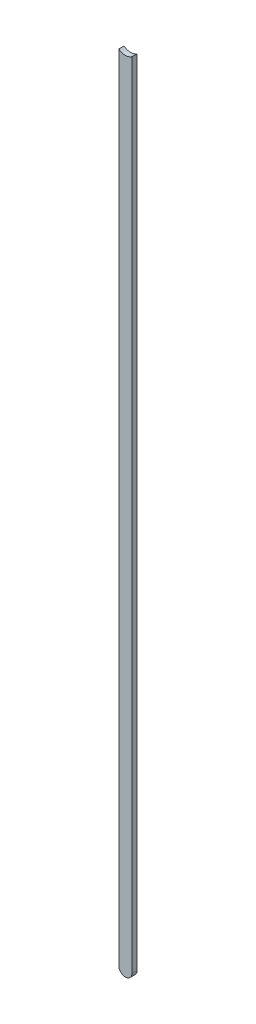
ISO-10303-21;
HEADER;
FILE_DESCRIPTION(('STEP AP214'),'2;1');
FILE_NAME('part.step','',(''),(''),'','','');
FILE_SCHEMA(('AUTOMOTIVE_DESIGN { 1 0 10303 214 1 1 1 1 }'));
ENDSEC;
DATA;
#1=APPLICATION_CONTEXT('core data for automotive mechanical design processes');
#2=APPLICATION_PROTOCOL_DEFINITION('international standard','automotive_design',2000,#1);
#3=PRODUCT_CONTEXT('',#1,'mechanical');
#4=PRODUCT('Part','Part','',(#3));
#5=PRODUCT_RELATED_PRODUCT_CATEGORY('part','',(#4));
#6=PRODUCT_DEFINITION_FORMATION('','',#4);
#7=PRODUCT_DEFINITION_CONTEXT('part definition',#1,'design');
#8=PRODUCT_DEFINITION('design','',#6,#7);
#9=PRODUCT_DEFINITION_SHAPE('','',#8);
#10=(LENGTH_UNIT() NAMED_UNIT(*) SI_UNIT(.MILLI.,.METRE.));
#11=(NAMED_UNIT(*) PLANE_ANGLE_UNIT() SI_UNIT($,.RADIAN.));
#12=(NAMED_UNIT(*) SI_UNIT($,.STERADIAN.) SOLID_ANGLE_UNIT());
#13=UNCERTAINTY_MEASURE_WITH_UNIT(LENGTH_MEASURE(1.E-05),#10,'distance_accuracy_value','');
#14=(GEOMETRIC_REPRESENTATION_CONTEXT(3) GLOBAL_UNCERTAINTY_ASSIGNED_CONTEXT((#13)) GLOBAL_UNIT_ASSIGNED_CONTEXT((#10,
#11,#12)) REPRESENTATION_CONTEXT('',''));
#15=CARTESIAN_POINT('',(0.,0.,0.));
#16=DIRECTION('',(0.,0.,1.));
#17=DIRECTION('',(1.,0.,0.));
#18=AXIS2_PLACEMENT_3D('',#15,#16,#17);
#19=CARTESIAN_POINT('',(104.521,78.613,0.));
#20=DIRECTION('',(-1.,0.,0.));
#21=DIRECTION('',(0.,1.,0.));
#22=AXIS2_PLACEMENT_3D('',#19,#20,#21);
#23=PLANE('',#22);
#24=DIRECTION('',(0.,1.,0.));
#25=VECTOR('',#24,1.);
#26=CARTESIAN_POINT('',(104.521,78.613,0.1999996));
#27=LINE('',#26,#25);
#28=CARTESIAN_POINT('',(104.521,78.613,0.1999996));
#29=VERTEX_POINT('',#28);
#30=CARTESIAN_POINT('',(104.521,109.006251768897,0.1999996));
#31=VERTEX_POINT('',#30);
#32=EDGE_CURVE('E11',#29,#31,#27,.T.);
#33=ORIENTED_EDGE('',*,*,#32,.F.);
#34=DIRECTION('',(0.,0.,1.));
#35=VECTOR('',#34,1.);
#36=CARTESIAN_POINT('',(104.521,78.613,0.));
#37=LINE('',#36,#35);
#38=CARTESIAN_POINT('',(104.521,78.613,0.));
#39=VERTEX_POINT('',#38);
#40=EDGE_CURVE('E24',#39,#29,#37,.T.);
#41=ORIENTED_EDGE('',*,*,#40,.F.);
#42=DIRECTION('',(0.,1.,0.));
#43=VECTOR('',#42,1.);
#44=CARTESIAN_POINT('',(104.521,78.613,0.));
#45=LINE('',#44,#43);
#46=CARTESIAN_POINT('',(104.521,109.006251768897,0.));
#47=VERTEX_POINT('',#46);
#48=EDGE_CURVE('E75',#39,#47,#45,.T.);
#49=ORIENTED_EDGE('',*,*,#48,.T.);
#50=DIRECTION('',(0.,0.,1.));
#51=VECTOR('',#50,1.);
#52=CARTESIAN_POINT('',(104.521,109.006251768897,0.));
#53=LINE('',#52,#51);
#54=EDGE_CURVE('E37',#47,#31,#53,.T.);
#55=ORIENTED_EDGE('',*,*,#54,.T.);
#56=EDGE_LOOP('',(#33,#41,#49,#55));
#57=FACE_BOUND('',#56,.T.);
#58=ADVANCED_FACE('F17',(#57),#23,.F.);
#59=CARTESIAN_POINT('',(104.267,109.347,0.));
#60=DIRECTION('',(0.,0.,-1.));
#61=DIRECTION('',(1.,0.,0.));
#62=AXIS2_PLACEMENT_3D('',#59,#60,#61);
#63=CYLINDRICAL_SURFACE('',#62,0.42500042);
#64=DIRECTION('',(0.,0.,1.));
#65=VECTOR('',#64,1.);
#66=CARTESIAN_POINT('',(104.013,109.006251768897,0.));
#67=LINE('',#66,#65);
#68=CARTESIAN_POINT('',(104.013,109.006251768897,0.));
#69=VERTEX_POINT('',#68);
#70=CARTESIAN_POINT('',(104.013,109.006251768897,0.1999996));
#71=VERTEX_POINT('',#70);
#72=EDGE_CURVE('E67',#69,#71,#67,.T.);
#73=ORIENTED_EDGE('',*,*,#72,.T.);
#74=CARTESIAN_POINT('',(104.267,109.347,0.1999996));
#75=DIRECTION('',(0.,0.,1.));
#76=DIRECTION('',(1.,0.,0.));
#77=AXIS2_PLACEMENT_3D('',#74,#75,#76);
#78=CIRCLE('',#77,0.42500042);
#79=EDGE_CURVE('E82',#71,#31,#78,.T.);
#80=ORIENTED_EDGE('',*,*,#79,.T.);
#81=ORIENTED_EDGE('',*,*,#54,.F.);
#82=CARTESIAN_POINT('',(104.267,109.347,0.));
#83=DIRECTION('',(0.,0.,1.));
#84=DIRECTION('',(1.,0.,0.));
#85=AXIS2_PLACEMENT_3D('',#82,#83,#84);
#86=CIRCLE('',#85,0.42500042);
#87=EDGE_CURVE('E80',#69,#47,#86,.T.);
#88=ORIENTED_EDGE('',*,*,#87,.F.);
#89=EDGE_LOOP('',(#73,#80,#81,#88));
#90=FACE_BOUND('',#89,.T.);
#91=ADVANCED_FACE('F88',(#90),#63,.F.);
#92=CARTESIAN_POINT('',(104.013,109.006251768897,0.));
#93=DIRECTION('',(1.,0.,0.));
#94=DIRECTION('',(0.,-1.,0.));
#95=AXIS2_PLACEMENT_3D('',#92,#93,#94);
#96=PLANE('',#95);
#97=DIRECTION('',(0.,-1.,0.));
#98=VECTOR('',#97,1.);
#99=CARTESIAN_POINT('',(104.013,109.347,0.1999996));
#100=LINE('',#99,#98);
#101=CARTESIAN_POINT('',(104.013,78.613,0.1999996));
#102=VERTEX_POINT('',#101);
#103=EDGE_CURVE('E71',#71,#102,#100,.T.);
#104=ORIENTED_EDGE('',*,*,#103,.F.);
#105=ORIENTED_EDGE('',*,*,#72,.F.);
#106=DIRECTION('',(0.,-1.,0.));
#107=VECTOR('',#106,1.);
#108=CARTESIAN_POINT('',(104.013,109.347,0.));
#109=LINE('',#108,#107);
#110=CARTESIAN_POINT('',(104.013,78.613,0.));
#111=VERTEX_POINT('',#110);
#112=EDGE_CURVE('E63',#69,#111,#109,.T.);
#113=ORIENTED_EDGE('',*,*,#112,.T.);
#114=DIRECTION('',(0.,0.,1.));
#115=VECTOR('',#114,1.);
#116=CARTESIAN_POINT('',(104.013,78.613,0.));
#117=LINE('',#116,#115);
#118=EDGE_CURVE('E53',#111,#102,#117,.T.);
#119=ORIENTED_EDGE('',*,*,#118,.T.);
#120=EDGE_LOOP('',(#104,#105,#113,#119));
#121=FACE_BOUND('',#120,.T.);
#122=ADVANCED_FACE('F66',(#121),#96,.F.);
#123=CARTESIAN_POINT('',(104.267,78.613,0.));
#124=DIRECTION('',(0.,0.,-1.));
#125=DIRECTION('',(-1.,0.,0.));
#126=AXIS2_PLACEMENT_3D('',#123,#124,#125);
#127=CYLINDRICAL_SURFACE('',#126,0.253999999999995);
#128=CARTESIAN_POINT('',(104.267,78.613,0.1999996));
#129=DIRECTION('',(0.,0.,1.));
#130=DIRECTION('',(-1.,0.,0.));
#131=AXIS2_PLACEMENT_3D('',#128,#129,#130);
#132=CIRCLE('',#131,0.253999999999995);
#133=EDGE_CURVE('E59',#102,#29,#132,.T.);
#134=ORIENTED_EDGE('',*,*,#133,.F.);
#135=ORIENTED_EDGE('',*,*,#118,.F.);
#136=CARTESIAN_POINT('',(104.267,78.613,0.));
#137=DIRECTION('',(0.,0.,1.));
#138=DIRECTION('',(-1.,0.,0.));
#139=AXIS2_PLACEMENT_3D('',#136,#137,#138);
#140=CIRCLE('',#139,0.253999999999995);
#141=EDGE_CURVE('E57',#111,#39,#140,.T.);
#142=ORIENTED_EDGE('',*,*,#141,.T.);
#143=ORIENTED_EDGE('',*,*,#40,.T.);
#144=EDGE_LOOP('',(#134,#135,#142,#143));
#145=FACE_BOUND('',#144,.T.);
#146=ADVANCED_FACE('F55',(#145),#127,.T.);
#147=CARTESIAN_POINT('',(104.521,78.613,0.));
#148=DIRECTION('',(0.,0.,-1.));
#149=DIRECTION('',(-1.,0.,0.));
#150=AXIS2_PLACEMENT_3D('',#147,#148,#149);
#151=PLANE('',#150);
#152=ORIENTED_EDGE('',*,*,#48,.F.);
#153=ORIENTED_EDGE('',*,*,#141,.F.);
#154=ORIENTED_EDGE('',*,*,#112,.F.);
#155=ORIENTED_EDGE('',*,*,#87,.T.);
#156=EDGE_LOOP('',(#152,#153,#154,#155));
#157=FACE_BOUND('',#156,.T.);
#158=ADVANCED_FACE('F74',(#157),#151,.T.);
#159=CARTESIAN_POINT('',(104.521,78.613,0.1999996));
#160=DIRECTION('',(0.,0.,-1.));
#161=DIRECTION('',(-1.,0.,0.));
#162=AXIS2_PLACEMENT_3D('',#159,#160,#161);
#163=PLANE('',#162);
#164=ORIENTED_EDGE('',*,*,#133,.T.);
#165=ORIENTED_EDGE('',*,*,#32,.T.);
#166=ORIENTED_EDGE('',*,*,#79,.F.);
#167=ORIENTED_EDGE('',*,*,#103,.T.);
#168=EDGE_LOOP('',(#164,#165,#166,#167));
#169=FACE_BOUND('',#168,.T.);
#170=ADVANCED_FACE('F91',(#169),#163,.F.);
#171=CLOSED_SHELL('',(#58,#91,#122,#146,#158,#170));
#172=MANIFOLD_SOLID_BREP('B1',#171);
#173=ADVANCED_BREP_SHAPE_REPRESENTATION('',(#18,#172),#14);
#174=SHAPE_DEFINITION_REPRESENTATION(#9,#173);
ENDSEC;
END-ISO-10303-21;
